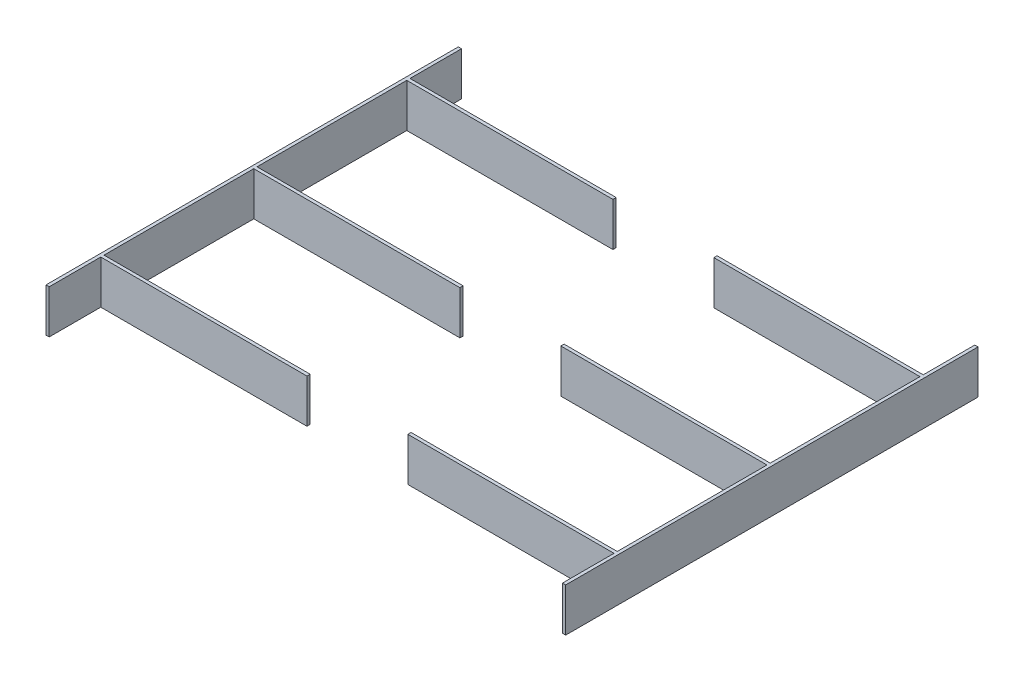
ISO-10303-21;
HEADER;
FILE_DESCRIPTION(('STEP AP214'),'2;1');
FILE_NAME('part.step','',(''),(''),'','','');
FILE_SCHEMA(('AUTOMOTIVE_DESIGN { 1 0 10303 214 1 1 1 1 }'));
ENDSEC;
DATA;
#1=APPLICATION_CONTEXT('core data for automotive mechanical design processes');
#2=APPLICATION_PROTOCOL_DEFINITION('international standard','automotive_design',2000,#1);
#3=PRODUCT_CONTEXT('',#1,'mechanical');
#4=PRODUCT('Part','Part','',(#3));
#5=PRODUCT_RELATED_PRODUCT_CATEGORY('part','',(#4));
#6=PRODUCT_DEFINITION_FORMATION('','',#4);
#7=PRODUCT_DEFINITION_CONTEXT('part definition',#1,'design');
#8=PRODUCT_DEFINITION('design','',#6,#7);
#9=PRODUCT_DEFINITION_SHAPE('','',#8);
#10=(LENGTH_UNIT() NAMED_UNIT(*) SI_UNIT(.MILLI.,.METRE.));
#11=(NAMED_UNIT(*) PLANE_ANGLE_UNIT() SI_UNIT($,.RADIAN.));
#12=(NAMED_UNIT(*) SI_UNIT($,.STERADIAN.) SOLID_ANGLE_UNIT());
#13=UNCERTAINTY_MEASURE_WITH_UNIT(LENGTH_MEASURE(1.E-05),#10,'distance_accuracy_value','');
#14=(GEOMETRIC_REPRESENTATION_CONTEXT(3) GLOBAL_UNCERTAINTY_ASSIGNED_CONTEXT((#13)) GLOBAL_UNIT_ASSIGNED_CONTEXT((#10,
#11,#12)) REPRESENTATION_CONTEXT('',''));
#15=CARTESIAN_POINT('',(0.,0.,0.));
#16=DIRECTION('',(0.,0.,1.));
#17=DIRECTION('',(1.,0.,0.));
#18=AXIS2_PLACEMENT_3D('',#15,#16,#17);
#19=CARTESIAN_POINT('',(1517.65,257.175,914.399999999999));
#20=DIRECTION('',(1.,0.,0.));
#21=DIRECTION('',(0.,0.,-1.));
#22=AXIS2_PLACEMENT_3D('',#19,#20,#21);
#23=PLANE('',#22);
#24=DIRECTION('',(0.,0.,1.));
#25=VECTOR('',#24,1.);
#26=CARTESIAN_POINT('',(1517.65,0.,914.399999999999));
#27=LINE('',#26,#25);
#28=CARTESIAN_POINT('',(1517.65,0.,914.399999999999));
#29=VERTEX_POINT('',#28);
#30=CARTESIAN_POINT('',(1517.65,0.,1219.2));
#31=VERTEX_POINT('',#30);
#32=EDGE_CURVE('E12',#29,#31,#27,.T.);
#33=ORIENTED_EDGE('',*,*,#32,.T.);
#34=DIRECTION('',(0.,-1.,0.));
#35=VECTOR('',#34,1.);
#36=CARTESIAN_POINT('',(1517.65,257.175,1219.2));
#37=LINE('',#36,#35);
#38=CARTESIAN_POINT('',(1517.65,257.175,1219.2));
#39=VERTEX_POINT('',#38);
#40=EDGE_CURVE('E61',#39,#31,#37,.T.);
#41=ORIENTED_EDGE('',*,*,#40,.F.);
#42=DIRECTION('',(0.,0.,1.));
#43=VECTOR('',#42,1.);
#44=CARTESIAN_POINT('',(1517.65,257.175,914.399999999999));
#45=LINE('',#44,#43);
#46=CARTESIAN_POINT('',(1517.65,257.175,914.399999999999));
#47=VERTEX_POINT('',#46);
#48=EDGE_CURVE('E46',#47,#39,#45,.T.);
#49=ORIENTED_EDGE('',*,*,#48,.F.);
#50=DIRECTION('',(0.,-1.,0.));
#51=VECTOR('',#50,1.);
#52=CARTESIAN_POINT('',(1517.65,257.175,914.399999999999));
#53=LINE('',#52,#51);
#54=EDGE_CURVE('E121',#47,#29,#53,.T.);
#55=ORIENTED_EDGE('',*,*,#54,.T.);
#56=EDGE_LOOP('',(#33,#41,#49,#55));
#57=FACE_BOUND('',#56,.T.);
#58=ADVANCED_FACE('F42',(#57),#23,.F.);
#59=CARTESIAN_POINT('',(1536.7,257.175,1219.2));
#60=DIRECTION('',(0.,0.,1.));
#61=DIRECTION('',(1.,0.,0.));
#62=AXIS2_PLACEMENT_3D('',#59,#60,#61);
#63=PLANE('',#62);
#64=DIRECTION('',(-1.,0.,0.));
#65=VECTOR('',#64,1.);
#66=CARTESIAN_POINT('',(1536.7,0.,1219.2));
#67=LINE('',#66,#65);
#68=CARTESIAN_POINT('',(1536.7,0.,1219.2));
#69=VERTEX_POINT('',#68);
#70=EDGE_CURVE('E52',#69,#31,#67,.T.);
#71=ORIENTED_EDGE('',*,*,#70,.F.);
#72=DIRECTION('',(0.,-1.,0.));
#73=VECTOR('',#72,1.);
#74=CARTESIAN_POINT('',(1536.7,257.175,1219.2));
#75=LINE('',#74,#73);
#76=CARTESIAN_POINT('',(1536.7,257.175,1219.2));
#77=VERTEX_POINT('',#76);
#78=EDGE_CURVE('E110',#77,#69,#75,.T.);
#79=ORIENTED_EDGE('',*,*,#78,.F.);
#80=DIRECTION('',(-1.,0.,0.));
#81=VECTOR('',#80,1.);
#82=CARTESIAN_POINT('',(1536.7,257.175,1219.2));
#83=LINE('',#82,#81);
#84=EDGE_CURVE('E218',#77,#39,#83,.T.);
#85=ORIENTED_EDGE('',*,*,#84,.T.);
#86=ORIENTED_EDGE('',*,*,#40,.T.);
#87=EDGE_LOOP('',(#71,#79,#85,#86));
#88=FACE_BOUND('',#87,.T.);
#89=ADVANCED_FACE('F339',(#88),#63,.T.);
#90=CARTESIAN_POINT('',(1536.7,257.175,-1219.2));
#91=DIRECTION('',(1.,0.,0.));
#92=DIRECTION('',(0.,0.,-1.));
#93=AXIS2_PLACEMENT_3D('',#90,#91,#92);
#94=PLANE('',#93);
#95=DIRECTION('',(0.,0.,1.));
#96=VECTOR('',#95,1.);
#97=CARTESIAN_POINT('',(1536.7,0.,-1219.2));
#98=LINE('',#97,#96);
#99=CARTESIAN_POINT('',(1536.7,0.,-1219.2));
#100=VERTEX_POINT('',#99);
#101=EDGE_CURVE('E179',#100,#69,#98,.T.);
#102=ORIENTED_EDGE('',*,*,#101,.F.);
#103=DIRECTION('',(0.,-1.,0.));
#104=VECTOR('',#103,1.);
#105=CARTESIAN_POINT('',(1536.7,257.175,-1219.2));
#106=LINE('',#105,#104);
#107=CARTESIAN_POINT('',(1536.7,257.175,-1219.2));
#108=VERTEX_POINT('',#107);
#109=EDGE_CURVE('E161',#108,#100,#106,.T.);
#110=ORIENTED_EDGE('',*,*,#109,.F.);
#111=DIRECTION('',(0.,0.,1.));
#112=VECTOR('',#111,1.);
#113=CARTESIAN_POINT('',(1536.7,257.175,-1219.2));
#114=LINE('',#113,#112);
#115=EDGE_CURVE('E217',#108,#77,#114,.T.);
#116=ORIENTED_EDGE('',*,*,#115,.T.);
#117=ORIENTED_EDGE('',*,*,#78,.T.);
#118=EDGE_LOOP('',(#102,#110,#116,#117));
#119=FACE_BOUND('',#118,.T.);
#120=ADVANCED_FACE('F183',(#119),#94,.T.);
#121=CARTESIAN_POINT('',(1536.7,257.175,-1219.2));
#122=DIRECTION('',(0.,0.,1.));
#123=DIRECTION('',(1.,0.,0.));
#124=AXIS2_PLACEMENT_3D('',#121,#122,#123);
#125=PLANE('',#124);
#126=DIRECTION('',(-1.,0.,0.));
#127=VECTOR('',#126,1.);
#128=CARTESIAN_POINT('',(1536.7,0.,-1219.2));
#129=LINE('',#128,#127);
#130=CARTESIAN_POINT('',(1517.65,0.,-1219.2));
#131=VERTEX_POINT('',#130);
#132=EDGE_CURVE('E165',#100,#131,#129,.T.);
#133=ORIENTED_EDGE('',*,*,#132,.T.);
#134=DIRECTION('',(0.,-1.,0.));
#135=VECTOR('',#134,1.);
#136=CARTESIAN_POINT('',(1517.65,257.175,-1219.2));
#137=LINE('',#136,#135);
#138=CARTESIAN_POINT('',(1517.65,257.175,-1219.2));
#139=VERTEX_POINT('',#138);
#140=EDGE_CURVE('E172',#139,#131,#137,.T.);
#141=ORIENTED_EDGE('',*,*,#140,.F.);
#142=DIRECTION('',(-1.,0.,0.));
#143=VECTOR('',#142,1.);
#144=CARTESIAN_POINT('',(1536.7,257.175,-1219.2));
#145=LINE('',#144,#143);
#146=EDGE_CURVE('E167',#108,#139,#145,.T.);
#147=ORIENTED_EDGE('',*,*,#146,.F.);
#148=ORIENTED_EDGE('',*,*,#109,.T.);
#149=EDGE_LOOP('',(#133,#141,#147,#148));
#150=FACE_BOUND('',#149,.T.);
#151=ADVANCED_FACE('F163',(#150),#125,.F.);
#152=CARTESIAN_POINT('',(1517.65,257.175,-1219.2));
#153=DIRECTION('',(1.,0.,0.));
#154=DIRECTION('',(0.,0.,-1.));
#155=AXIS2_PLACEMENT_3D('',#152,#153,#154);
#156=PLANE('',#155);
#157=DIRECTION('',(0.,0.,1.));
#158=VECTOR('',#157,1.);
#159=CARTESIAN_POINT('',(1517.65,0.,-1219.2));
#160=LINE('',#159,#158);
#161=CARTESIAN_POINT('',(1517.65,0.,-914.399999999999));
#162=VERTEX_POINT('',#161);
#163=EDGE_CURVE('E181',#131,#162,#160,.T.);
#164=ORIENTED_EDGE('',*,*,#163,.T.);
#165=DIRECTION('',(0.,-1.,0.));
#166=VECTOR('',#165,1.);
#167=CARTESIAN_POINT('',(1517.65,257.175,-914.399999999999));
#168=LINE('',#167,#166);
#169=CARTESIAN_POINT('',(1517.65,257.175,-914.399999999999));
#170=VERTEX_POINT('',#169);
#171=EDGE_CURVE('E257',#170,#162,#168,.T.);
#172=ORIENTED_EDGE('',*,*,#171,.F.);
#173=DIRECTION('',(0.,0.,1.));
#174=VECTOR('',#173,1.);
#175=CARTESIAN_POINT('',(1517.65,257.175,-1219.2));
#176=LINE('',#175,#174);
#177=EDGE_CURVE('E214',#139,#170,#176,.T.);
#178=ORIENTED_EDGE('',*,*,#177,.F.);
#179=ORIENTED_EDGE('',*,*,#140,.T.);
#180=EDGE_LOOP('',(#164,#172,#178,#179));
#181=FACE_BOUND('',#180,.T.);
#182=ADVANCED_FACE('F255',(#181),#156,.F.);
#183=CARTESIAN_POINT('',(1517.65,257.175,-914.399999999999));
#184=DIRECTION('',(0.,0.,1.));
#185=DIRECTION('',(1.,0.,0.));
#186=AXIS2_PLACEMENT_3D('',#183,#184,#185);
#187=PLANE('',#186);
#188=DIRECTION('',(-1.,0.,0.));
#189=VECTOR('',#188,1.);
#190=CARTESIAN_POINT('',(1517.65,0.,-914.399999999999));
#191=LINE('',#190,#189);
#192=CARTESIAN_POINT('',(298.45,0.,-914.399999999999));
#193=VERTEX_POINT('',#192);
#194=EDGE_CURVE('E250',#162,#193,#191,.T.);
#195=ORIENTED_EDGE('',*,*,#194,.T.);
#196=DIRECTION('',(0.,-1.,0.));
#197=VECTOR('',#196,1.);
#198=CARTESIAN_POINT('',(298.45,257.175,-914.399999999999));
#199=LINE('',#198,#197);
#200=CARTESIAN_POINT('',(298.45,257.175,-914.399999999999));
#201=VERTEX_POINT('',#200);
#202=EDGE_CURVE('E262',#201,#193,#199,.T.);
#203=ORIENTED_EDGE('',*,*,#202,.F.);
#204=DIRECTION('',(-1.,0.,0.));
#205=VECTOR('',#204,1.);
#206=CARTESIAN_POINT('',(1517.65,257.175,-914.399999999999));
#207=LINE('',#206,#205);
#208=EDGE_CURVE('E212',#170,#201,#207,.T.);
#209=ORIENTED_EDGE('',*,*,#208,.F.);
#210=ORIENTED_EDGE('',*,*,#171,.T.);
#211=EDGE_LOOP('',(#195,#203,#209,#210));
#212=FACE_BOUND('',#211,.T.);
#213=ADVANCED_FACE('F260',(#212),#187,.F.);
#214=CARTESIAN_POINT('',(298.45,257.175,-895.349999999999));
#215=DIRECTION('',(-1.,0.,0.));
#216=DIRECTION('',(0.,0.,1.));
#217=AXIS2_PLACEMENT_3D('',#214,#215,#216);
#218=PLANE('',#217);
#219=DIRECTION('',(0.,0.,-1.));
#220=VECTOR('',#219,1.);
#221=CARTESIAN_POINT('',(298.45,0.,-895.349999999999));
#222=LINE('',#221,#220);
#223=CARTESIAN_POINT('',(298.45,0.,-895.349999999999));
#224=VERTEX_POINT('',#223);
#225=EDGE_CURVE('E247',#224,#193,#222,.T.);
#226=ORIENTED_EDGE('',*,*,#225,.F.);
#227=DIRECTION('',(0.,-1.,0.));
#228=VECTOR('',#227,1.);
#229=CARTESIAN_POINT('',(298.45,257.175,-895.349999999999));
#230=LINE('',#229,#228);
#231=CARTESIAN_POINT('',(298.45,257.175,-895.349999999999));
#232=VERTEX_POINT('',#231);
#233=EDGE_CURVE('E269',#232,#224,#230,.T.);
#234=ORIENTED_EDGE('',*,*,#233,.F.);
#235=DIRECTION('',(0.,0.,-1.));
#236=VECTOR('',#235,1.);
#237=CARTESIAN_POINT('',(298.45,257.175,-895.349999999999));
#238=LINE('',#237,#236);
#239=EDGE_CURVE('E209',#232,#201,#238,.T.);
#240=ORIENTED_EDGE('',*,*,#239,.T.);
#241=ORIENTED_EDGE('',*,*,#202,.T.);
#242=EDGE_LOOP('',(#226,#234,#240,#241));
#243=FACE_BOUND('',#242,.T.);
#244=ADVANCED_FACE('F268',(#243),#218,.T.);
#245=CARTESIAN_POINT('',(1517.65,257.175,-895.349999999999));
#246=DIRECTION('',(0.,0.,1.));
#247=DIRECTION('',(1.,0.,0.));
#248=AXIS2_PLACEMENT_3D('',#245,#246,#247);
#249=PLANE('',#248);
#250=DIRECTION('',(-1.,0.,0.));
#251=VECTOR('',#250,1.);
#252=CARTESIAN_POINT('',(1517.65,0.,-895.349999999999));
#253=LINE('',#252,#251);
#254=CARTESIAN_POINT('',(1517.65,0.,-895.349999999999));
#255=VERTEX_POINT('',#254);
#256=EDGE_CURVE('E244',#255,#224,#253,.T.);
#257=ORIENTED_EDGE('',*,*,#256,.F.);
#258=DIRECTION('',(0.,-1.,0.));
#259=VECTOR('',#258,1.);
#260=CARTESIAN_POINT('',(1517.65,257.175,-895.349999999999));
#261=LINE('',#260,#259);
#262=CARTESIAN_POINT('',(1517.65,257.175,-895.349999999999));
#263=VERTEX_POINT('',#262);
#264=EDGE_CURVE('E272',#263,#255,#261,.T.);
#265=ORIENTED_EDGE('',*,*,#264,.F.);
#266=DIRECTION('',(-1.,0.,0.));
#267=VECTOR('',#266,1.);
#268=CARTESIAN_POINT('',(1517.65,257.175,-895.349999999999));
#269=LINE('',#268,#267);
#270=EDGE_CURVE('E206',#263,#232,#269,.T.);
#271=ORIENTED_EDGE('',*,*,#270,.T.);
#272=ORIENTED_EDGE('',*,*,#233,.T.);
#273=EDGE_LOOP('',(#257,#265,#271,#272));
#274=FACE_BOUND('',#273,.T.);
#275=ADVANCED_FACE('F329',(#274),#249,.T.);
#276=CARTESIAN_POINT('',(1517.65,257.175,-895.349999999999));
#277=DIRECTION('',(1.,0.,0.));
#278=DIRECTION('',(0.,0.,-1.));
#279=AXIS2_PLACEMENT_3D('',#276,#277,#278);
#280=PLANE('',#279);
#281=DIRECTION('',(0.,0.,1.));
#282=VECTOR('',#281,1.);
#283=CARTESIAN_POINT('',(1517.65,0.,-895.349999999999));
#284=LINE('',#283,#282);
#285=CARTESIAN_POINT('',(1517.65,0.,-9.52499999999956));
#286=VERTEX_POINT('',#285);
#287=EDGE_CURVE('E242',#255,#286,#284,.T.);
#288=ORIENTED_EDGE('',*,*,#287,.T.);
#289=DIRECTION('',(0.,-1.,0.));
#290=VECTOR('',#289,1.);
#291=CARTESIAN_POINT('',(1517.65,257.175,-9.52499999999956));
#292=LINE('',#291,#290);
#293=CARTESIAN_POINT('',(1517.65,257.175,-9.52499999999956));
#294=VERTEX_POINT('',#293);
#295=EDGE_CURVE('E277',#294,#286,#292,.T.);
#296=ORIENTED_EDGE('',*,*,#295,.F.);
#297=DIRECTION('',(0.,0.,1.));
#298=VECTOR('',#297,1.);
#299=CARTESIAN_POINT('',(1517.65,257.175,-895.349999999999));
#300=LINE('',#299,#298);
#301=EDGE_CURVE('E204',#263,#294,#300,.T.);
#302=ORIENTED_EDGE('',*,*,#301,.F.);
#303=ORIENTED_EDGE('',*,*,#264,.T.);
#304=EDGE_LOOP('',(#288,#296,#302,#303));
#305=FACE_BOUND('',#304,.T.);
#306=ADVANCED_FACE('F326',(#305),#280,.F.);
#307=CARTESIAN_POINT('',(1517.65,257.175,-9.52499999999956));
#308=DIRECTION('',(0.,0.,1.));
#309=DIRECTION('',(1.,0.,0.));
#310=AXIS2_PLACEMENT_3D('',#307,#308,#309);
#311=PLANE('',#310);
#312=DIRECTION('',(-1.,0.,0.));
#313=VECTOR('',#312,1.);
#314=CARTESIAN_POINT('',(1517.65,0.,-9.52499999999956));
#315=LINE('',#314,#313);
#316=CARTESIAN_POINT('',(298.45,0.,-9.52500000000001));
#317=VERTEX_POINT('',#316);
#318=EDGE_CURVE('E240',#286,#317,#315,.T.);
#319=ORIENTED_EDGE('',*,*,#318,.T.);
#320=DIRECTION('',(0.,-1.,0.));
#321=VECTOR('',#320,1.);
#322=CARTESIAN_POINT('',(298.45,257.175,-9.52500000000001));
#323=LINE('',#322,#321);
#324=CARTESIAN_POINT('',(298.45,257.175,-9.52500000000001));
#325=VERTEX_POINT('',#324);
#326=EDGE_CURVE('E280',#325,#317,#323,.T.);
#327=ORIENTED_EDGE('',*,*,#326,.F.);
#328=DIRECTION('',(-1.,0.,0.));
#329=VECTOR('',#328,1.);
#330=CARTESIAN_POINT('',(1517.65,257.175,-9.52499999999956));
#331=LINE('',#330,#329);
#332=EDGE_CURVE('E202',#294,#325,#331,.T.);
#333=ORIENTED_EDGE('',*,*,#332,.F.);
#334=ORIENTED_EDGE('',*,*,#295,.T.);
#335=EDGE_LOOP('',(#319,#327,#333,#334));
#336=FACE_BOUND('',#335,.T.);
#337=ADVANCED_FACE('F322',(#336),#311,.F.);
#338=CARTESIAN_POINT('',(298.45,257.175,-9.52500000000001));
#339=DIRECTION('',(1.,0.,0.));
#340=DIRECTION('',(0.,0.,-1.));
#341=AXIS2_PLACEMENT_3D('',#338,#339,#340);
#342=PLANE('',#341);
#343=DIRECTION('',(0.,0.,1.));
#344=VECTOR('',#343,1.);
#345=CARTESIAN_POINT('',(298.45,0.,-9.52500000000001));
#346=LINE('',#345,#344);
#347=CARTESIAN_POINT('',(298.45,0.,9.52500000000001));
#348=VERTEX_POINT('',#347);
#349=EDGE_CURVE('E237',#317,#348,#346,.T.);
#350=ORIENTED_EDGE('',*,*,#349,.T.);
#351=DIRECTION('',(0.,-1.,0.));
#352=VECTOR('',#351,1.);
#353=CARTESIAN_POINT('',(298.45,257.175,9.52500000000001));
#354=LINE('',#353,#352);
#355=CARTESIAN_POINT('',(298.45,257.175,9.52500000000001));
#356=VERTEX_POINT('',#355);
#357=EDGE_CURVE('E283',#356,#348,#354,.T.);
#358=ORIENTED_EDGE('',*,*,#357,.F.);
#359=DIRECTION('',(0.,0.,1.));
#360=VECTOR('',#359,1.);
#361=CARTESIAN_POINT('',(298.45,257.175,-9.52500000000001));
#362=LINE('',#361,#360);
#363=EDGE_CURVE('E200',#325,#356,#362,.T.);
#364=ORIENTED_EDGE('',*,*,#363,.F.);
#365=ORIENTED_EDGE('',*,*,#326,.T.);
#366=EDGE_LOOP('',(#350,#358,#364,#365));
#367=FACE_BOUND('',#366,.T.);
#368=ADVANCED_FACE('F317',(#367),#342,.F.);
#369=CARTESIAN_POINT('',(1517.65,257.175,9.52499999999956));
#370=DIRECTION('',(0.,0.,1.));
#371=DIRECTION('',(1.,0.,0.));
#372=AXIS2_PLACEMENT_3D('',#369,#370,#371);
#373=PLANE('',#372);
#374=DIRECTION('',(-1.,0.,0.));
#375=VECTOR('',#374,1.);
#376=CARTESIAN_POINT('',(1517.65,0.,9.52499999999956));
#377=LINE('',#376,#375);
#378=CARTESIAN_POINT('',(1517.65,0.,9.52499999999956));
#379=VERTEX_POINT('',#378);
#380=EDGE_CURVE('E234',#379,#348,#377,.T.);
#381=ORIENTED_EDGE('',*,*,#380,.F.);
#382=DIRECTION('',(0.,-1.,0.));
#383=VECTOR('',#382,1.);
#384=CARTESIAN_POINT('',(1517.65,257.175,9.52499999999956));
#385=LINE('',#384,#383);
#386=CARTESIAN_POINT('',(1517.65,257.175,9.52499999999956));
#387=VERTEX_POINT('',#386);
#388=EDGE_CURVE('E285',#387,#379,#385,.T.);
#389=ORIENTED_EDGE('',*,*,#388,.F.);
#390=DIRECTION('',(-1.,0.,0.));
#391=VECTOR('',#390,1.);
#392=CARTESIAN_POINT('',(1517.65,257.175,9.52499999999956));
#393=LINE('',#392,#391);
#394=EDGE_CURVE('E197',#387,#356,#393,.T.);
#395=ORIENTED_EDGE('',*,*,#394,.T.);
#396=ORIENTED_EDGE('',*,*,#357,.T.);
#397=EDGE_LOOP('',(#381,#389,#395,#396));
#398=FACE_BOUND('',#397,.T.);
#399=ADVANCED_FACE('F312',(#398),#373,.T.);
#400=CARTESIAN_POINT('',(1517.65,257.175,9.52499999999956));
#401=DIRECTION('',(1.,0.,0.));
#402=DIRECTION('',(0.,0.,-1.));
#403=AXIS2_PLACEMENT_3D('',#400,#401,#402);
#404=PLANE('',#403);
#405=DIRECTION('',(0.,0.,1.));
#406=VECTOR('',#405,1.);
#407=CARTESIAN_POINT('',(1517.65,0.,9.52499999999956));
#408=LINE('',#407,#406);
#409=CARTESIAN_POINT('',(1517.65,0.,895.349999999999));
#410=VERTEX_POINT('',#409);
#411=EDGE_CURVE('E232',#379,#410,#408,.T.);
#412=ORIENTED_EDGE('',*,*,#411,.T.);
#413=DIRECTION('',(0.,-1.,0.));
#414=VECTOR('',#413,1.);
#415=CARTESIAN_POINT('',(1517.65,257.175,895.349999999999));
#416=LINE('',#415,#414);
#417=CARTESIAN_POINT('',(1517.65,257.175,895.349999999999));
#418=VERTEX_POINT('',#417);
#419=EDGE_CURVE('E287',#418,#410,#416,.T.);
#420=ORIENTED_EDGE('',*,*,#419,.F.);
#421=DIRECTION('',(0.,0.,1.));
#422=VECTOR('',#421,1.);
#423=CARTESIAN_POINT('',(1517.65,257.175,9.52499999999956));
#424=LINE('',#423,#422);
#425=EDGE_CURVE('E195',#387,#418,#424,.T.);
#426=ORIENTED_EDGE('',*,*,#425,.F.);
#427=ORIENTED_EDGE('',*,*,#388,.T.);
#428=EDGE_LOOP('',(#412,#420,#426,#427));
#429=FACE_BOUND('',#428,.T.);
#430=ADVANCED_FACE('F309',(#429),#404,.F.);
#431=CARTESIAN_POINT('',(1517.65,257.175,895.349999999999));
#432=DIRECTION('',(0.,0.,1.));
#433=DIRECTION('',(1.,0.,0.));
#434=AXIS2_PLACEMENT_3D('',#431,#432,#433);
#435=PLANE('',#434);
#436=DIRECTION('',(-1.,0.,0.));
#437=VECTOR('',#436,1.);
#438=CARTESIAN_POINT('',(1517.65,0.,895.349999999999));
#439=LINE('',#438,#437);
#440=CARTESIAN_POINT('',(298.45,0.,895.349999999999));
#441=VERTEX_POINT('',#440);
#442=EDGE_CURVE('E226',#410,#441,#439,.T.);
#443=ORIENTED_EDGE('',*,*,#442,.T.);
#444=DIRECTION('',(0.,-1.,0.));
#445=VECTOR('',#444,1.);
#446=CARTESIAN_POINT('',(298.45,257.175,895.349999999999));
#447=LINE('',#446,#445);
#448=CARTESIAN_POINT('',(298.45,257.175,895.349999999999));
#449=VERTEX_POINT('',#448);
#450=EDGE_CURVE('E290',#449,#441,#447,.T.);
#451=ORIENTED_EDGE('',*,*,#450,.F.);
#452=DIRECTION('',(-1.,0.,0.));
#453=VECTOR('',#452,1.);
#454=CARTESIAN_POINT('',(1517.65,257.175,895.349999999999));
#455=LINE('',#454,#453);
#456=EDGE_CURVE('E193',#418,#449,#455,.T.);
#457=ORIENTED_EDGE('',*,*,#456,.F.);
#458=ORIENTED_EDGE('',*,*,#419,.T.);
#459=EDGE_LOOP('',(#443,#451,#457,#458));
#460=FACE_BOUND('',#459,.T.);
#461=ADVANCED_FACE('F304',(#460),#435,.F.);
#462=CARTESIAN_POINT('',(298.45,257.175,895.349999999999));
#463=DIRECTION('',(1.,0.,0.));
#464=DIRECTION('',(0.,0.,-1.));
#465=AXIS2_PLACEMENT_3D('',#462,#463,#464);
#466=PLANE('',#465);
#467=DIRECTION('',(0.,0.,1.));
#468=VECTOR('',#467,1.);
#469=CARTESIAN_POINT('',(298.45,0.,895.349999999999));
#470=LINE('',#469,#468);
#471=CARTESIAN_POINT('',(298.45,0.,914.399999999999));
#472=VERTEX_POINT('',#471);
#473=EDGE_CURVE('E221',#441,#472,#470,.T.);
#474=ORIENTED_EDGE('',*,*,#473,.T.);
#475=DIRECTION('',(0.,-1.,0.));
#476=VECTOR('',#475,1.);
#477=CARTESIAN_POINT('',(298.45,257.175,914.399999999999));
#478=LINE('',#477,#476);
#479=CARTESIAN_POINT('',(298.45,257.175,914.399999999999));
#480=VERTEX_POINT('',#479);
#481=EDGE_CURVE('E292',#480,#472,#478,.T.);
#482=ORIENTED_EDGE('',*,*,#481,.F.);
#483=DIRECTION('',(0.,0.,1.));
#484=VECTOR('',#483,1.);
#485=CARTESIAN_POINT('',(298.45,257.175,895.349999999999));
#486=LINE('',#485,#484);
#487=EDGE_CURVE('E191',#449,#480,#486,.T.);
#488=ORIENTED_EDGE('',*,*,#487,.F.);
#489=ORIENTED_EDGE('',*,*,#450,.T.);
#490=EDGE_LOOP('',(#474,#482,#488,#489));
#491=FACE_BOUND('',#490,.T.);
#492=ADVANCED_FACE('F298',(#491),#466,.F.);
#493=CARTESIAN_POINT('',(1517.65,257.175,914.399999999999));
#494=DIRECTION('',(0.,0.,1.));
#495=DIRECTION('',(1.,0.,0.));
#496=AXIS2_PLACEMENT_3D('',#493,#494,#495);
#497=PLANE('',#496);
#498=DIRECTION('',(-1.,0.,0.));
#499=VECTOR('',#498,1.);
#500=CARTESIAN_POINT('',(1517.65,0.,914.399999999999));
#501=LINE('',#500,#499);
#502=EDGE_CURVE('E219',#29,#472,#501,.T.);
#503=ORIENTED_EDGE('',*,*,#502,.F.);
#504=ORIENTED_EDGE('',*,*,#54,.F.);
#505=DIRECTION('',(-1.,0.,0.));
#506=VECTOR('',#505,1.);
#507=CARTESIAN_POINT('',(1517.65,257.175,914.399999999999));
#508=LINE('',#507,#506);
#509=EDGE_CURVE('E188',#47,#480,#508,.T.);
#510=ORIENTED_EDGE('',*,*,#509,.T.);
#511=ORIENTED_EDGE('',*,*,#481,.T.);
#512=EDGE_LOOP('',(#503,#504,#510,#511));
#513=FACE_BOUND('',#512,.T.);
#514=ADVANCED_FACE('F295',(#513),#497,.T.);
#515=CARTESIAN_POINT('',(0.,257.175,0.));
#516=DIRECTION('',(0.,-1.,0.));
#517=DIRECTION('',(0.,0.,-1.));
#518=AXIS2_PLACEMENT_3D('',#515,#516,#517);
#519=PLANE('',#518);
#520=ORIENTED_EDGE('',*,*,#48,.T.);
#521=ORIENTED_EDGE('',*,*,#84,.F.);
#522=ORIENTED_EDGE('',*,*,#115,.F.);
#523=ORIENTED_EDGE('',*,*,#146,.T.);
#524=ORIENTED_EDGE('',*,*,#177,.T.);
#525=ORIENTED_EDGE('',*,*,#208,.T.);
#526=ORIENTED_EDGE('',*,*,#239,.F.);
#527=ORIENTED_EDGE('',*,*,#270,.F.);
#528=ORIENTED_EDGE('',*,*,#301,.T.);
#529=ORIENTED_EDGE('',*,*,#332,.T.);
#530=ORIENTED_EDGE('',*,*,#363,.T.);
#531=ORIENTED_EDGE('',*,*,#394,.F.);
#532=ORIENTED_EDGE('',*,*,#425,.T.);
#533=ORIENTED_EDGE('',*,*,#456,.T.);
#534=ORIENTED_EDGE('',*,*,#487,.T.);
#535=ORIENTED_EDGE('',*,*,#509,.F.);
#536=EDGE_LOOP('',(#520,#521,#522,#523,#524,#525,#526,#527,#528,#529,#530,#531,#532,#533,#534,#535));
#537=FACE_BOUND('',#536,.T.);
#538=ADVANCED_FACE('F44',(#537),#519,.F.);
#539=CARTESIAN_POINT('',(0.,0.,0.));
#540=DIRECTION('',(0.,-1.,0.));
#541=DIRECTION('',(0.,0.,-1.));
#542=AXIS2_PLACEMENT_3D('',#539,#540,#541);
#543=PLANE('',#542);
#544=ORIENTED_EDGE('',*,*,#32,.F.);
#545=ORIENTED_EDGE('',*,*,#502,.T.);
#546=ORIENTED_EDGE('',*,*,#473,.F.);
#547=ORIENTED_EDGE('',*,*,#442,.F.);
#548=ORIENTED_EDGE('',*,*,#411,.F.);
#549=ORIENTED_EDGE('',*,*,#380,.T.);
#550=ORIENTED_EDGE('',*,*,#349,.F.);
#551=ORIENTED_EDGE('',*,*,#318,.F.);
#552=ORIENTED_EDGE('',*,*,#287,.F.);
#553=ORIENTED_EDGE('',*,*,#256,.T.);
#554=ORIENTED_EDGE('',*,*,#225,.T.);
#555=ORIENTED_EDGE('',*,*,#194,.F.);
#556=ORIENTED_EDGE('',*,*,#163,.F.);
#557=ORIENTED_EDGE('',*,*,#132,.F.);
#558=ORIENTED_EDGE('',*,*,#101,.T.);
#559=ORIENTED_EDGE('',*,*,#70,.T.);
#560=EDGE_LOOP('',(#544,#545,#546,#547,#548,#549,#550,#551,#552,#553,#554,#555,#556,#557,#558,#559));
#561=FACE_BOUND('',#560,.T.);
#562=ADVANCED_FACE('F177',(#561),#543,.T.);
#563=CLOSED_SHELL('',(#58,#89,#120,#151,#182,#213,#244,#275,#306,#337,#368,#399,#430,#461,#492,
#514,#538,#562));
#564=MANIFOLD_SOLID_BREP('B2',#563);
#565=CARTESIAN_POINT('',(-1517.65,257.175,-1219.2));
#566=DIRECTION('',(1.,0.,0.));
#567=DIRECTION('',(0.,0.,-1.));
#568=AXIS2_PLACEMENT_3D('',#565,#566,#567);
#569=PLANE('',#568);
#570=DIRECTION('',(0.,0.,1.));
#571=VECTOR('',#570,1.);
#572=CARTESIAN_POINT('',(-1517.65,0.,-1219.2));
#573=LINE('',#572,#571);
#574=CARTESIAN_POINT('',(-1517.65,0.,-1219.2));
#575=VERTEX_POINT('',#574);
#576=CARTESIAN_POINT('',(-1517.65,0.,-914.399999999999));
#577=VERTEX_POINT('',#576);
#578=EDGE_CURVE('E622',#575,#577,#573,.T.);
#579=ORIENTED_EDGE('',*,*,#578,.F.);
#580=DIRECTION('',(0.,-1.,0.));
#581=VECTOR('',#580,1.);
#582=CARTESIAN_POINT('',(-1517.65,257.175,-1219.2));
#583=LINE('',#582,#581);
#584=CARTESIAN_POINT('',(-1517.65,257.175,-1219.2));
#585=VERTEX_POINT('',#584);
#586=EDGE_CURVE('E40',#585,#575,#583,.T.);
#587=ORIENTED_EDGE('',*,*,#586,.F.);
#588=DIRECTION('',(0.,0.,1.));
#589=VECTOR('',#588,1.);
#590=CARTESIAN_POINT('',(-1517.65,257.175,-1219.2));
#591=LINE('',#590,#589);
#592=CARTESIAN_POINT('',(-1517.65,257.175,-914.399999999999));
#593=VERTEX_POINT('',#592);
#594=EDGE_CURVE('E665',#585,#593,#591,.T.);
#595=ORIENTED_EDGE('',*,*,#594,.T.);
#596=DIRECTION('',(0.,-1.,0.));
#597=VECTOR('',#596,1.);
#598=CARTESIAN_POINT('',(-1517.65,257.175,-914.399999999999));
#599=LINE('',#598,#597);
#600=EDGE_CURVE('E480',#593,#577,#599,.T.);
#601=ORIENTED_EDGE('',*,*,#600,.T.);
#602=EDGE_LOOP('',(#579,#587,#595,#601));
#603=FACE_BOUND('',#602,.T.);
#604=ADVANCED_FACE('F477',(#603),#569,.T.);
#605=CARTESIAN_POINT('',(-1536.7,257.175,-1219.2));
#606=DIRECTION('',(0.,0.,-1.));
#607=DIRECTION('',(-1.,0.,0.));
#608=AXIS2_PLACEMENT_3D('',#605,#606,#607);
#609=PLANE('',#608);
#610=DIRECTION('',(1.,0.,0.));
#611=VECTOR('',#610,1.);
#612=CARTESIAN_POINT('',(-1536.7,0.,-1219.2));
#613=LINE('',#612,#611);
#614=CARTESIAN_POINT('',(-1536.7,0.,-1219.2));
#615=VERTEX_POINT('',#614);
#616=EDGE_CURVE('E663',#615,#575,#613,.T.);
#617=ORIENTED_EDGE('',*,*,#616,.F.);
#618=DIRECTION('',(0.,-1.,0.));
#619=VECTOR('',#618,1.);
#620=CARTESIAN_POINT('',(-1536.7,257.175,-1219.2));
#621=LINE('',#620,#619);
#622=CARTESIAN_POINT('',(-1536.7,257.175,-1219.2));
#623=VERTEX_POINT('',#622);
#624=EDGE_CURVE('E486',#623,#615,#621,.T.);
#625=ORIENTED_EDGE('',*,*,#624,.F.);
#626=DIRECTION('',(1.,0.,0.));
#627=VECTOR('',#626,1.);
#628=CARTESIAN_POINT('',(-1536.7,257.175,-1219.2));
#629=LINE('',#628,#627);
#630=EDGE_CURVE('E602',#623,#585,#629,.T.);
#631=ORIENTED_EDGE('',*,*,#630,.T.);
#632=ORIENTED_EDGE('',*,*,#586,.T.);
#633=EDGE_LOOP('',(#617,#625,#631,#632));
#634=FACE_BOUND('',#633,.T.);
#635=ADVANCED_FACE('F695',(#634),#609,.T.);
#636=CARTESIAN_POINT('',(-1536.7,257.175,-1219.2));
#637=DIRECTION('',(1.,0.,0.));
#638=DIRECTION('',(0.,0.,-1.));
#639=AXIS2_PLACEMENT_3D('',#636,#637,#638);
#640=PLANE('',#639);
#641=DIRECTION('',(0.,0.,1.));
#642=VECTOR('',#641,1.);
#643=CARTESIAN_POINT('',(-1536.7,0.,-1219.2));
#644=LINE('',#643,#642);
#645=CARTESIAN_POINT('',(-1536.7,0.,1219.2));
#646=VERTEX_POINT('',#645);
#647=EDGE_CURVE('E607',#615,#646,#644,.T.);
#648=ORIENTED_EDGE('',*,*,#647,.T.);
#649=DIRECTION('',(0.,-1.,0.));
#650=VECTOR('',#649,1.);
#651=CARTESIAN_POINT('',(-1536.7,257.175,1219.2));
#652=LINE('',#651,#650);
#653=CARTESIAN_POINT('',(-1536.7,257.175,1219.2));
#654=VERTEX_POINT('',#653);
#655=EDGE_CURVE('E605',#654,#646,#652,.T.);
#656=ORIENTED_EDGE('',*,*,#655,.F.);
#657=DIRECTION('',(0.,0.,1.));
#658=VECTOR('',#657,1.);
#659=CARTESIAN_POINT('',(-1536.7,257.175,-1219.2));
#660=LINE('',#659,#658);
#661=EDGE_CURVE('E595',#623,#654,#660,.T.);
#662=ORIENTED_EDGE('',*,*,#661,.F.);
#663=ORIENTED_EDGE('',*,*,#624,.T.);
#664=EDGE_LOOP('',(#648,#656,#662,#663));
#665=FACE_BOUND('',#664,.T.);
#666=ADVANCED_FACE('F606',(#665),#640,.F.);
#667=CARTESIAN_POINT('',(-1536.7,257.175,1219.2));
#668=DIRECTION('',(0.,0.,-1.));
#669=DIRECTION('',(-1.,0.,0.));
#670=AXIS2_PLACEMENT_3D('',#667,#668,#669);
#671=PLANE('',#670);
#672=DIRECTION('',(1.,0.,0.));
#673=VECTOR('',#672,1.);
#674=CARTESIAN_POINT('',(-1536.7,0.,1219.2));
#675=LINE('',#674,#673);
#676=CARTESIAN_POINT('',(-1517.65,0.,1219.2));
#677=VERTEX_POINT('',#676);
#678=EDGE_CURVE('E660',#646,#677,#675,.T.);
#679=ORIENTED_EDGE('',*,*,#678,.T.);
#680=DIRECTION('',(0.,-1.,0.));
#681=VECTOR('',#680,1.);
#682=CARTESIAN_POINT('',(-1517.65,257.175,1219.2));
#683=LINE('',#682,#681);
#684=CARTESIAN_POINT('',(-1517.65,257.175,1219.2));
#685=VERTEX_POINT('',#684);
#686=EDGE_CURVE('E611',#685,#677,#683,.T.);
#687=ORIENTED_EDGE('',*,*,#686,.F.);
#688=DIRECTION('',(1.,0.,0.));
#689=VECTOR('',#688,1.);
#690=CARTESIAN_POINT('',(-1536.7,257.175,1219.2));
#691=LINE('',#690,#689);
#692=EDGE_CURVE('E600',#654,#685,#691,.T.);
#693=ORIENTED_EDGE('',*,*,#692,.F.);
#694=ORIENTED_EDGE('',*,*,#655,.T.);
#695=EDGE_LOOP('',(#679,#687,#693,#694));
#696=FACE_BOUND('',#695,.T.);
#697=ADVANCED_FACE('F613',(#696),#671,.F.);
#698=CARTESIAN_POINT('',(-1517.65,257.175,914.399999999999));
#699=DIRECTION('',(1.,0.,0.));
#700=DIRECTION('',(0.,0.,-1.));
#701=AXIS2_PLACEMENT_3D('',#698,#699,#700);
#702=PLANE('',#701);
#703=DIRECTION('',(0.,0.,1.));
#704=VECTOR('',#703,1.);
#705=CARTESIAN_POINT('',(-1517.65,0.,914.399999999999));
#706=LINE('',#705,#704);
#707=CARTESIAN_POINT('',(-1517.65,0.,914.399999999999));
#708=VERTEX_POINT('',#707);
#709=EDGE_CURVE('E657',#708,#677,#706,.T.);
#710=ORIENTED_EDGE('',*,*,#709,.F.);
#711=DIRECTION('',(0.,-1.,0.));
#712=VECTOR('',#711,1.);
#713=CARTESIAN_POINT('',(-1517.65,257.175,914.399999999999));
#714=LINE('',#713,#712);
#715=CARTESIAN_POINT('',(-1517.65,257.175,914.399999999999));
#716=VERTEX_POINT('',#715);
#717=EDGE_CURVE('E669',#716,#708,#714,.T.);
#718=ORIENTED_EDGE('',*,*,#717,.F.);
#719=DIRECTION('',(0.,0.,1.));
#720=VECTOR('',#719,1.);
#721=CARTESIAN_POINT('',(-1517.65,257.175,914.399999999999));
#722=LINE('',#721,#720);
#723=EDGE_CURVE('E615',#716,#685,#722,.T.);
#724=ORIENTED_EDGE('',*,*,#723,.T.);
#725=ORIENTED_EDGE('',*,*,#686,.T.);
#726=EDGE_LOOP('',(#710,#718,#724,#725));
#727=FACE_BOUND('',#726,.T.);
#728=ADVANCED_FACE('F708',(#727),#702,.T.);
#729=CARTESIAN_POINT('',(-1517.65,257.175,914.399999999999));
#730=DIRECTION('',(0.,0.,-1.));
#731=DIRECTION('',(-1.,0.,0.));
#732=AXIS2_PLACEMENT_3D('',#729,#730,#731);
#733=PLANE('',#732);
#734=DIRECTION('',(1.,0.,0.));
#735=VECTOR('',#734,1.);
#736=CARTESIAN_POINT('',(-1517.65,0.,914.399999999999));
#737=LINE('',#736,#735);
#738=CARTESIAN_POINT('',(-298.45,0.,914.399999999999));
#739=VERTEX_POINT('',#738);
#740=EDGE_CURVE('E654',#708,#739,#737,.T.);
#741=ORIENTED_EDGE('',*,*,#740,.T.);
#742=DIRECTION('',(0.,-1.,0.));
#743=VECTOR('',#742,1.);
#744=CARTESIAN_POINT('',(-298.45,257.175,914.399999999999));
#745=LINE('',#744,#743);
#746=CARTESIAN_POINT('',(-298.45,257.175,914.399999999999));
#747=VERTEX_POINT('',#746);
#748=EDGE_CURVE('E671',#747,#739,#745,.T.);
#749=ORIENTED_EDGE('',*,*,#748,.F.);
#750=DIRECTION('',(1.,0.,0.));
#751=VECTOR('',#750,1.);
#752=CARTESIAN_POINT('',(-1517.65,257.175,914.399999999999));
#753=LINE('',#752,#751);
#754=EDGE_CURVE('E617',#716,#747,#753,.T.);
#755=ORIENTED_EDGE('',*,*,#754,.F.);
#756=ORIENTED_EDGE('',*,*,#717,.T.);
#757=EDGE_LOOP('',(#741,#749,#755,#756));
#758=FACE_BOUND('',#757,.T.);
#759=ADVANCED_FACE('F711',(#758),#733,.F.);
#760=CARTESIAN_POINT('',(-298.45,257.175,895.349999999999));
#761=DIRECTION('',(1.,0.,0.));
#762=DIRECTION('',(0.,0.,-1.));
#763=AXIS2_PLACEMENT_3D('',#760,#761,#762);
#764=PLANE('',#763);
#765=DIRECTION('',(0.,0.,1.));
#766=VECTOR('',#765,1.);
#767=CARTESIAN_POINT('',(-298.45,0.,895.349999999999));
#768=LINE('',#767,#766);
#769=CARTESIAN_POINT('',(-298.45,0.,895.349999999999));
#770=VERTEX_POINT('',#769);
#771=EDGE_CURVE('E651',#770,#739,#768,.T.);
#772=ORIENTED_EDGE('',*,*,#771,.F.);
#773=DIRECTION('',(0.,-1.,0.));
#774=VECTOR('',#773,1.);
#775=CARTESIAN_POINT('',(-298.45,257.175,895.349999999999));
#776=LINE('',#775,#774);
#777=CARTESIAN_POINT('',(-298.45,257.175,895.349999999999));
#778=VERTEX_POINT('',#777);
#779=EDGE_CURVE('E673',#778,#770,#776,.T.);
#780=ORIENTED_EDGE('',*,*,#779,.F.);
#781=DIRECTION('',(0.,0.,1.));
#782=VECTOR('',#781,1.);
#783=CARTESIAN_POINT('',(-298.45,257.175,895.349999999999));
#784=LINE('',#783,#782);
#785=EDGE_CURVE('E892',#778,#747,#784,.T.);
#786=ORIENTED_EDGE('',*,*,#785,.T.);
#787=ORIENTED_EDGE('',*,*,#748,.T.);
#788=EDGE_LOOP('',(#772,#780,#786,#787));
#789=FACE_BOUND('',#788,.T.);
#790=ADVANCED_FACE('F715',(#789),#764,.T.);
#791=CARTESIAN_POINT('',(-1517.65,257.175,895.349999999999));
#792=DIRECTION('',(0.,0.,-1.));
#793=DIRECTION('',(-1.,0.,0.));
#794=AXIS2_PLACEMENT_3D('',#791,#792,#793);
#795=PLANE('',#794);
#796=DIRECTION('',(1.,0.,0.));
#797=VECTOR('',#796,1.);
#798=CARTESIAN_POINT('',(-1517.65,0.,895.349999999999));
#799=LINE('',#798,#797);
#800=CARTESIAN_POINT('',(-1517.65,0.,895.349999999999));
#801=VERTEX_POINT('',#800);
#802=EDGE_CURVE('E648',#801,#770,#799,.T.);
#803=ORIENTED_EDGE('',*,*,#802,.F.);
#804=DIRECTION('',(0.,-1.,0.));
#805=VECTOR('',#804,1.);
#806=CARTESIAN_POINT('',(-1517.65,257.175,895.349999999999));
#807=LINE('',#806,#805);
#808=CARTESIAN_POINT('',(-1517.65,257.175,895.349999999999));
#809=VERTEX_POINT('',#808);
#810=EDGE_CURVE('E675',#809,#801,#807,.T.);
#811=ORIENTED_EDGE('',*,*,#810,.F.);
#812=DIRECTION('',(1.,0.,0.));
#813=VECTOR('',#812,1.);
#814=CARTESIAN_POINT('',(-1517.65,257.175,895.349999999999));
#815=LINE('',#814,#813);
#816=EDGE_CURVE('E888',#809,#778,#815,.T.);
#817=ORIENTED_EDGE('',*,*,#816,.T.);
#818=ORIENTED_EDGE('',*,*,#779,.T.);
#819=EDGE_LOOP('',(#803,#811,#817,#818));
#820=FACE_BOUND('',#819,.T.);
#821=ADVANCED_FACE('F719',(#820),#795,.T.);
#822=CARTESIAN_POINT('',(-1517.65,257.175,9.5249999999999));
#823=DIRECTION('',(1.,0.,0.));
#824=DIRECTION('',(0.,0.,-1.));
#825=AXIS2_PLACEMENT_3D('',#822,#823,#824);
#826=PLANE('',#825);
#827=DIRECTION('',(0.,0.,1.));
#828=VECTOR('',#827,1.);
#829=CARTESIAN_POINT('',(-1517.65,0.,9.5249999999999));
#830=LINE('',#829,#828);
#831=CARTESIAN_POINT('',(-1517.65,0.,9.5249999999999));
#832=VERTEX_POINT('',#831);
#833=EDGE_CURVE('E645',#832,#801,#830,.T.);
#834=ORIENTED_EDGE('',*,*,#833,.F.);
#835=DIRECTION('',(0.,-1.,0.));
#836=VECTOR('',#835,1.);
#837=CARTESIAN_POINT('',(-1517.65,257.175,9.5249999999999));
#838=LINE('',#837,#836);
#839=CARTESIAN_POINT('',(-1517.65,257.175,9.5249999999999));
#840=VERTEX_POINT('',#839);
#841=EDGE_CURVE('E677',#840,#832,#838,.T.);
#842=ORIENTED_EDGE('',*,*,#841,.F.);
#843=DIRECTION('',(0.,0.,1.));
#844=VECTOR('',#843,1.);
#845=CARTESIAN_POINT('',(-1517.65,257.175,9.5249999999999));
#846=LINE('',#845,#844);
#847=EDGE_CURVE('E882',#840,#809,#846,.T.);
#848=ORIENTED_EDGE('',*,*,#847,.T.);
#849=ORIENTED_EDGE('',*,*,#810,.T.);
#850=EDGE_LOOP('',(#834,#842,#848,#849));
#851=FACE_BOUND('',#850,.T.);
#852=ADVANCED_FACE('F723',(#851),#826,.T.);
#853=CARTESIAN_POINT('',(-1517.65,257.175,9.5249999999999));
#854=DIRECTION('',(0.,0.,-1.));
#855=DIRECTION('',(-1.,0.,0.));
#856=AXIS2_PLACEMENT_3D('',#853,#854,#855);
#857=PLANE('',#856);
#858=DIRECTION('',(1.,0.,0.));
#859=VECTOR('',#858,1.);
#860=CARTESIAN_POINT('',(-1517.65,0.,9.5249999999999));
#861=LINE('',#860,#859);
#862=CARTESIAN_POINT('',(-298.45,0.,9.5249999999999));
#863=VERTEX_POINT('',#862);
#864=EDGE_CURVE('E642',#832,#863,#861,.T.);
#865=ORIENTED_EDGE('',*,*,#864,.T.);
#866=DIRECTION('',(0.,-1.,0.));
#867=VECTOR('',#866,1.);
#868=CARTESIAN_POINT('',(-298.45,257.175,9.5249999999999));
#869=LINE('',#868,#867);
#870=CARTESIAN_POINT('',(-298.45,257.175,9.5249999999999));
#871=VERTEX_POINT('',#870);
#872=EDGE_CURVE('E679',#871,#863,#869,.T.);
#873=ORIENTED_EDGE('',*,*,#872,.F.);
#874=DIRECTION('',(1.,0.,0.));
#875=VECTOR('',#874,1.);
#876=CARTESIAN_POINT('',(-1517.65,257.175,9.5249999999999));
#877=LINE('',#876,#875);
#878=EDGE_CURVE('E879',#840,#871,#877,.T.);
#879=ORIENTED_EDGE('',*,*,#878,.F.);
#880=ORIENTED_EDGE('',*,*,#841,.T.);
#881=EDGE_LOOP('',(#865,#873,#879,#880));
#882=FACE_BOUND('',#881,.T.);
#883=ADVANCED_FACE('F727',(#882),#857,.F.);
#884=CARTESIAN_POINT('',(-298.45,257.175,-9.5249999999999));
#885=DIRECTION('',(1.,0.,0.));
#886=DIRECTION('',(0.,0.,-1.));
#887=AXIS2_PLACEMENT_3D('',#884,#885,#886);
#888=PLANE('',#887);
#889=DIRECTION('',(0.,0.,1.));
#890=VECTOR('',#889,1.);
#891=CARTESIAN_POINT('',(-298.45,0.,-9.5249999999999));
#892=LINE('',#891,#890);
#893=CARTESIAN_POINT('',(-298.45,0.,-9.5249999999999));
#894=VERTEX_POINT('',#893);
#895=EDGE_CURVE('E639',#894,#863,#892,.T.);
#896=ORIENTED_EDGE('',*,*,#895,.F.);
#897=DIRECTION('',(0.,-1.,0.));
#898=VECTOR('',#897,1.);
#899=CARTESIAN_POINT('',(-298.45,257.175,-9.5249999999999));
#900=LINE('',#899,#898);
#901=CARTESIAN_POINT('',(-298.45,257.175,-9.5249999999999));
#902=VERTEX_POINT('',#901);
#903=EDGE_CURVE('E681',#902,#894,#900,.T.);
#904=ORIENTED_EDGE('',*,*,#903,.F.);
#905=DIRECTION('',(0.,0.,1.));
#906=VECTOR('',#905,1.);
#907=CARTESIAN_POINT('',(-298.45,257.175,-9.5249999999999));
#908=LINE('',#907,#906);
#909=EDGE_CURVE('E877',#902,#871,#908,.T.);
#910=ORIENTED_EDGE('',*,*,#909,.T.);
#911=ORIENTED_EDGE('',*,*,#872,.T.);
#912=EDGE_LOOP('',(#896,#904,#910,#911));
#913=FACE_BOUND('',#912,.T.);
#914=ADVANCED_FACE('F731',(#913),#888,.T.);
#915=CARTESIAN_POINT('',(-1517.65,257.175,-9.5249999999999));
#916=DIRECTION('',(0.,0.,-1.));
#917=DIRECTION('',(-1.,0.,0.));
#918=AXIS2_PLACEMENT_3D('',#915,#916,#917);
#919=PLANE('',#918);
#920=DIRECTION('',(1.,0.,0.));
#921=VECTOR('',#920,1.);
#922=CARTESIAN_POINT('',(-1517.65,0.,-9.5249999999999));
#923=LINE('',#922,#921);
#924=CARTESIAN_POINT('',(-1517.65,0.,-9.5249999999999));
#925=VERTEX_POINT('',#924);
#926=EDGE_CURVE('E636',#925,#894,#923,.T.);
#927=ORIENTED_EDGE('',*,*,#926,.F.);
#928=DIRECTION('',(0.,-1.,0.));
#929=VECTOR('',#928,1.);
#930=CARTESIAN_POINT('',(-1517.65,257.175,-9.5249999999999));
#931=LINE('',#930,#929);
#932=CARTESIAN_POINT('',(-1517.65,257.175,-9.5249999999999));
#933=VERTEX_POINT('',#932);
#934=EDGE_CURVE('E683',#933,#925,#931,.T.);
#935=ORIENTED_EDGE('',*,*,#934,.F.);
#936=DIRECTION('',(1.,0.,0.));
#937=VECTOR('',#936,1.);
#938=CARTESIAN_POINT('',(-1517.65,257.175,-9.5249999999999));
#939=LINE('',#938,#937);
#940=EDGE_CURVE('E901',#933,#902,#939,.T.);
#941=ORIENTED_EDGE('',*,*,#940,.T.);
#942=ORIENTED_EDGE('',*,*,#903,.T.);
#943=EDGE_LOOP('',(#927,#935,#941,#942));
#944=FACE_BOUND('',#943,.T.);
#945=ADVANCED_FACE('F735',(#944),#919,.T.);
#946=CARTESIAN_POINT('',(-1517.65,257.175,-895.349999999999));
#947=DIRECTION('',(1.,0.,0.));
#948=DIRECTION('',(0.,0.,-1.));
#949=AXIS2_PLACEMENT_3D('',#946,#947,#948);
#950=PLANE('',#949);
#951=DIRECTION('',(0.,0.,1.));
#952=VECTOR('',#951,1.);
#953=CARTESIAN_POINT('',(-1517.65,0.,-895.349999999999));
#954=LINE('',#953,#952);
#955=CARTESIAN_POINT('',(-1517.65,0.,-895.349999999999));
#956=VERTEX_POINT('',#955);
#957=EDGE_CURVE('E633',#956,#925,#954,.T.);
#958=ORIENTED_EDGE('',*,*,#957,.F.);
#959=DIRECTION('',(0.,-1.,0.));
#960=VECTOR('',#959,1.);
#961=CARTESIAN_POINT('',(-1517.65,257.175,-895.349999999999));
#962=LINE('',#961,#960);
#963=CARTESIAN_POINT('',(-1517.65,257.175,-895.349999999999));
#964=VERTEX_POINT('',#963);
#965=EDGE_CURVE('E685',#964,#956,#962,.T.);
#966=ORIENTED_EDGE('',*,*,#965,.F.);
#967=DIRECTION('',(0.,0.,1.));
#968=VECTOR('',#967,1.);
#969=CARTESIAN_POINT('',(-1517.65,257.175,-895.349999999999));
#970=LINE('',#969,#968);
#971=EDGE_CURVE('E868',#964,#933,#970,.T.);
#972=ORIENTED_EDGE('',*,*,#971,.T.);
#973=ORIENTED_EDGE('',*,*,#934,.T.);
#974=EDGE_LOOP('',(#958,#966,#972,#973));
#975=FACE_BOUND('',#974,.T.);
#976=ADVANCED_FACE('F739',(#975),#950,.T.);
#977=CARTESIAN_POINT('',(-1517.65,257.175,-895.349999999999));
#978=DIRECTION('',(0.,0.,-1.));
#979=DIRECTION('',(-1.,0.,0.));
#980=AXIS2_PLACEMENT_3D('',#977,#978,#979);
#981=PLANE('',#980);
#982=DIRECTION('',(1.,0.,0.));
#983=VECTOR('',#982,1.);
#984=CARTESIAN_POINT('',(-1517.65,0.,-895.349999999999));
#985=LINE('',#984,#983);
#986=CARTESIAN_POINT('',(-298.45,0.,-895.349999999999));
#987=VERTEX_POINT('',#986);
#988=EDGE_CURVE('E631',#956,#987,#985,.T.);
#989=ORIENTED_EDGE('',*,*,#988,.T.);
#990=DIRECTION('',(0.,-1.,0.));
#991=VECTOR('',#990,1.);
#992=CARTESIAN_POINT('',(-298.45,257.175,-895.349999999999));
#993=LINE('',#992,#991);
#994=CARTESIAN_POINT('',(-298.45,257.175,-895.349999999999));
#995=VERTEX_POINT('',#994);
#996=EDGE_CURVE('E687',#995,#987,#993,.T.);
#997=ORIENTED_EDGE('',*,*,#996,.F.);
#998=DIRECTION('',(1.,0.,0.));
#999=VECTOR('',#998,1.);
#1000=CARTESIAN_POINT('',(-1517.65,257.175,-895.349999999999));
#1001=LINE('',#1000,#999);
#1002=EDGE_CURVE('E904',#964,#995,#1001,.T.);
#1003=ORIENTED_EDGE('',*,*,#1002,.F.);
#1004=ORIENTED_EDGE('',*,*,#965,.T.);
#1005=EDGE_LOOP('',(#989,#997,#1003,#1004));
#1006=FACE_BOUND('',#1005,.T.);
#1007=ADVANCED_FACE('F743',(#1006),#981,.F.);
#1008=CARTESIAN_POINT('',(-298.45,257.175,-895.349999999999));
#1009=DIRECTION('',(-1.,0.,0.));
#1010=DIRECTION('',(0.,0.,1.));
#1011=AXIS2_PLACEMENT_3D('',#1008,#1009,#1010);
#1012=PLANE('',#1011);
#1013=DIRECTION('',(0.,0.,-1.));
#1014=VECTOR('',#1013,1.);
#1015=CARTESIAN_POINT('',(-298.45,0.,-895.349999999999));
#1016=LINE('',#1015,#1014);
#1017=CARTESIAN_POINT('',(-298.45,0.,-914.399999999999));
#1018=VERTEX_POINT('',#1017);
#1019=EDGE_CURVE('E628',#987,#1018,#1016,.T.);
#1020=ORIENTED_EDGE('',*,*,#1019,.T.);
#1021=DIRECTION('',(0.,-1.,0.));
#1022=VECTOR('',#1021,1.);
#1023=CARTESIAN_POINT('',(-298.45,257.175,-914.399999999999));
#1024=LINE('',#1023,#1022);
#1025=CARTESIAN_POINT('',(-298.45,257.175,-914.399999999999));
#1026=VERTEX_POINT('',#1025);
#1027=EDGE_CURVE('E689',#1026,#1018,#1024,.T.);
#1028=ORIENTED_EDGE('',*,*,#1027,.F.);
#1029=DIRECTION('',(0.,0.,-1.));
#1030=VECTOR('',#1029,1.);
#1031=CARTESIAN_POINT('',(-298.45,257.175,-895.349999999999));
#1032=LINE('',#1031,#1030);
#1033=EDGE_CURVE('E906',#995,#1026,#1032,.T.);
#1034=ORIENTED_EDGE('',*,*,#1033,.F.);
#1035=ORIENTED_EDGE('',*,*,#996,.T.);
#1036=EDGE_LOOP('',(#1020,#1028,#1034,#1035));
#1037=FACE_BOUND('',#1036,.T.);
#1038=ADVANCED_FACE('F747',(#1037),#1012,.F.);
#1039=CARTESIAN_POINT('',(-1517.65,257.175,-914.399999999999));
#1040=DIRECTION('',(0.,0.,-1.));
#1041=DIRECTION('',(-1.,0.,0.));
#1042=AXIS2_PLACEMENT_3D('',#1039,#1040,#1041);
#1043=PLANE('',#1042);
#1044=DIRECTION('',(1.,0.,0.));
#1045=VECTOR('',#1044,1.);
#1046=CARTESIAN_POINT('',(-1517.65,0.,-914.399999999999));
#1047=LINE('',#1046,#1045);
#1048=EDGE_CURVE('E625',#577,#1018,#1047,.T.);
#1049=ORIENTED_EDGE('',*,*,#1048,.F.);
#1050=ORIENTED_EDGE('',*,*,#600,.F.);
#1051=DIRECTION('',(1.,0.,0.));
#1052=VECTOR('',#1051,1.);
#1053=CARTESIAN_POINT('',(-1517.65,257.175,-914.399999999999));
#1054=LINE('',#1053,#1052);
#1055=EDGE_CURVE('E908',#593,#1026,#1054,.T.);
#1056=ORIENTED_EDGE('',*,*,#1055,.T.);
#1057=ORIENTED_EDGE('',*,*,#1027,.T.);
#1058=EDGE_LOOP('',(#1049,#1050,#1056,#1057));
#1059=FACE_BOUND('',#1058,.T.);
#1060=ADVANCED_FACE('F691',(#1059),#1043,.T.);
#1061=CARTESIAN_POINT('',(0.,257.175,0.));
#1062=DIRECTION('',(0.,1.,0.));
#1063=DIRECTION('',(0.,0.,1.));
#1064=AXIS2_PLACEMENT_3D('',#1061,#1062,#1063);
#1065=PLANE('',#1064);
#1066=ORIENTED_EDGE('',*,*,#594,.F.);
#1067=ORIENTED_EDGE('',*,*,#630,.F.);
#1068=ORIENTED_EDGE('',*,*,#661,.T.);
#1069=ORIENTED_EDGE('',*,*,#692,.T.);
#1070=ORIENTED_EDGE('',*,*,#723,.F.);
#1071=ORIENTED_EDGE('',*,*,#754,.T.);
#1072=ORIENTED_EDGE('',*,*,#785,.F.);
#1073=ORIENTED_EDGE('',*,*,#816,.F.);
#1074=ORIENTED_EDGE('',*,*,#847,.F.);
#1075=ORIENTED_EDGE('',*,*,#878,.T.);
#1076=ORIENTED_EDGE('',*,*,#909,.F.);
#1077=ORIENTED_EDGE('',*,*,#940,.F.);
#1078=ORIENTED_EDGE('',*,*,#971,.F.);
#1079=ORIENTED_EDGE('',*,*,#1002,.T.);
#1080=ORIENTED_EDGE('',*,*,#1033,.T.);
#1081=ORIENTED_EDGE('',*,*,#1055,.F.);
#1082=EDGE_LOOP('',(#1066,#1067,#1068,#1069,#1070,#1071,#1072,#1073,#1074,#1075,#1076,#1077,
#1078,#1079,#1080,#1081));
#1083=FACE_BOUND('',#1082,.T.);
#1084=ADVANCED_FACE('F597',(#1083),#1065,.T.);
#1085=CARTESIAN_POINT('',(0.,0.,0.));
#1086=DIRECTION('',(0.,1.,0.));
#1087=DIRECTION('',(0.,0.,1.));
#1088=AXIS2_PLACEMENT_3D('',#1085,#1086,#1087);
#1089=PLANE('',#1088);
#1090=ORIENTED_EDGE('',*,*,#578,.T.);
#1091=ORIENTED_EDGE('',*,*,#1048,.T.);
#1092=ORIENTED_EDGE('',*,*,#1019,.F.);
#1093=ORIENTED_EDGE('',*,*,#988,.F.);
#1094=ORIENTED_EDGE('',*,*,#957,.T.);
#1095=ORIENTED_EDGE('',*,*,#926,.T.);
#1096=ORIENTED_EDGE('',*,*,#895,.T.);
#1097=ORIENTED_EDGE('',*,*,#864,.F.);
#1098=ORIENTED_EDGE('',*,*,#833,.T.);
#1099=ORIENTED_EDGE('',*,*,#802,.T.);
#1100=ORIENTED_EDGE('',*,*,#771,.T.);
#1101=ORIENTED_EDGE('',*,*,#740,.F.);
#1102=ORIENTED_EDGE('',*,*,#709,.T.);
#1103=ORIENTED_EDGE('',*,*,#678,.F.);
#1104=ORIENTED_EDGE('',*,*,#647,.F.);
#1105=ORIENTED_EDGE('',*,*,#616,.T.);
#1106=EDGE_LOOP('',(#1090,#1091,#1092,#1093,#1094,#1095,#1096,#1097,#1098,#1099,#1100,#1101,
#1102,#1103,#1104,#1105));
#1107=FACE_BOUND('',#1106,.T.);
#1108=ADVANCED_FACE('F694',(#1107),#1089,.F.);
#1109=CLOSED_SHELL('',(#604,#635,#666,#697,#728,#759,#790,#821,#852,#883,#914,#945,#976,#1007,
#1038,#1060,#1084,#1108));
#1110=MANIFOLD_SOLID_BREP('B6',#1109);
#1111=ADVANCED_BREP_SHAPE_REPRESENTATION('',(#18,#564,#1110),#14);
#1112=SHAPE_DEFINITION_REPRESENTATION(#9,#1111);
ENDSEC;
END-ISO-10303-21;
